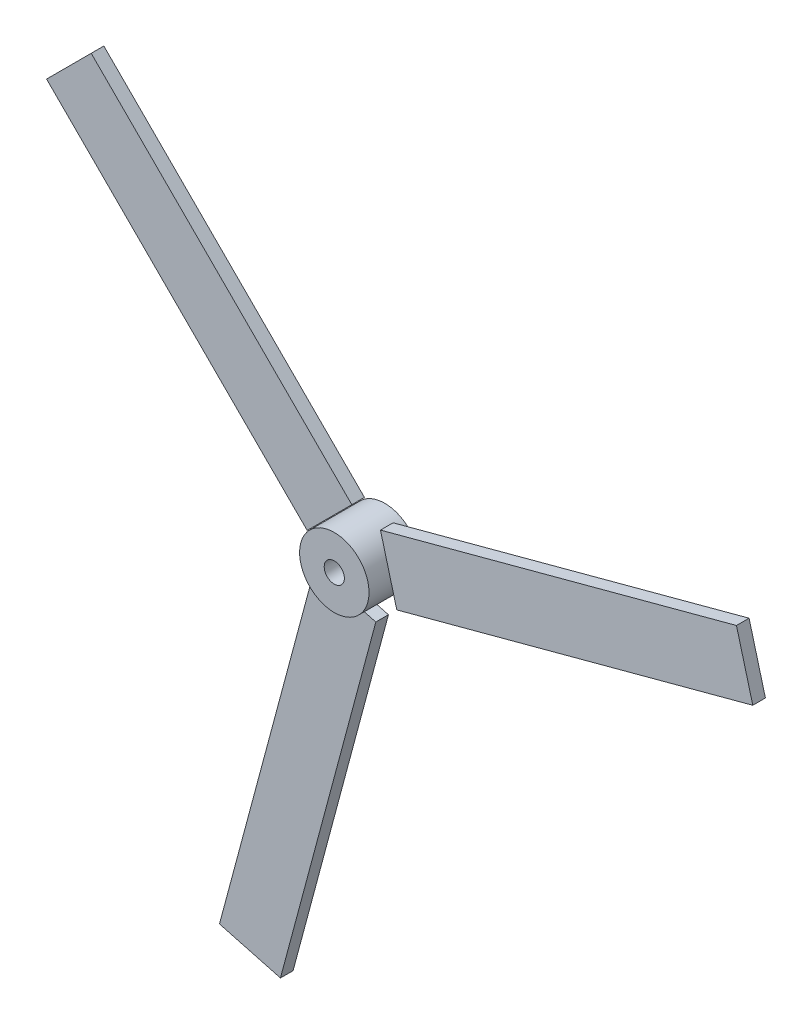
ISO-10303-21;
HEADER;
FILE_DESCRIPTION(('STEP AP214'),'2;1');
FILE_NAME('part.step','',(''),(''),'','','');
FILE_SCHEMA(('AUTOMOTIVE_DESIGN { 1 0 10303 214 1 1 1 1 }'));
ENDSEC;
DATA;
#1=APPLICATION_CONTEXT('core data for automotive mechanical design processes');
#2=APPLICATION_PROTOCOL_DEFINITION('international standard','automotive_design',2000,#1);
#3=PRODUCT_CONTEXT('',#1,'mechanical');
#4=PRODUCT('Part','Part','',(#3));
#5=PRODUCT_RELATED_PRODUCT_CATEGORY('part','',(#4));
#6=PRODUCT_DEFINITION_FORMATION('','',#4);
#7=PRODUCT_DEFINITION_CONTEXT('part definition',#1,'design');
#8=PRODUCT_DEFINITION('design','',#6,#7);
#9=PRODUCT_DEFINITION_SHAPE('','',#8);
#10=(LENGTH_UNIT() NAMED_UNIT(*) SI_UNIT(.MILLI.,.METRE.));
#11=(NAMED_UNIT(*) PLANE_ANGLE_UNIT() SI_UNIT($,.RADIAN.));
#12=(NAMED_UNIT(*) SI_UNIT($,.STERADIAN.) SOLID_ANGLE_UNIT());
#13=UNCERTAINTY_MEASURE_WITH_UNIT(LENGTH_MEASURE(1.E-05),#10,'distance_accuracy_value','');
#14=(GEOMETRIC_REPRESENTATION_CONTEXT(3) GLOBAL_UNCERTAINTY_ASSIGNED_CONTEXT((#13)) GLOBAL_UNIT_ASSIGNED_CONTEXT((#10,
#11,#12)) REPRESENTATION_CONTEXT('',''));
#15=CARTESIAN_POINT('',(0.,0.,0.));
#16=DIRECTION('',(0.,0.,1.));
#17=DIRECTION('',(1.,0.,0.));
#18=AXIS2_PLACEMENT_3D('',#15,#16,#17);
#19=CARTESIAN_POINT('',(-45.57303204747,45.573032047473,13.4));
#20=DIRECTION('',(0.,0.,1.));
#21=DIRECTION('',(1.,0.,0.));
#22=AXIS2_PLACEMENT_3D('',#19,#20,#21);
#23=PLANE('',#22);
#24=CARTESIAN_POINT('',(-45.57303204747,45.573032047473,13.4));
#25=DIRECTION('',(0.,0.,1.));
#26=DIRECTION('',(0.965925826288944,0.258819045102985,0.));
#27=AXIS2_PLACEMENT_3D('',#24,#25,#26);
#28=CIRCLE('',#27,0.8);
#29=CARTESIAN_POINT('',(-44.80029138644,45.780087283555,13.4));
#30=VERTEX_POINT('',#29);
#31=EDGE_CURVE('P0_E25',#30,#30,#28,.T.);
#32=ORIENTED_EDGE('',*,*,#31,.F.);
#33=EDGE_LOOP('',(#32));
#34=FACE_BOUND('',#33,.T.);
#35=CARTESIAN_POINT('',(-45.57303204747,45.573032047473,13.4));
#36=DIRECTION('',(0.,0.,1.));
#37=DIRECTION('',(0.965925826288944,0.258819045102985,0.));
#38=AXIS2_PLACEMENT_3D('',#35,#36,#37);
#39=CIRCLE('',#38,2.75);
#40=CARTESIAN_POINT('',(-42.91673602517,46.284784421505,13.4));
#41=VERTEX_POINT('',#40);
#42=EDGE_CURVE('P0_E59',#41,#41,#39,.T.);
#43=ORIENTED_EDGE('',*,*,#42,.T.);
#44=EDGE_LOOP('',(#43));
#45=FACE_BOUND('',#44,.T.);
#46=ADVANCED_FACE('P0_F17',(#34,#45),#23,.T.);
#47=CARTESIAN_POINT('',(-45.57303204747,45.573032047473,9.4));
#48=DIRECTION('',(0.,0.,1.));
#49=DIRECTION('',(1.,0.,0.));
#50=AXIS2_PLACEMENT_3D('',#47,#48,#49);
#51=PLANE('',#50);
#52=CARTESIAN_POINT('',(-45.57303204747,45.573032047473,9.4));
#53=DIRECTION('',(0.,0.,1.));
#54=DIRECTION('',(0.965925826288944,0.258819045102985,0.));
#55=AXIS2_PLACEMENT_3D('',#52,#53,#54);
#56=CIRCLE('',#55,0.8);
#57=CARTESIAN_POINT('',(-44.80029138644,45.780087283555,9.4));
#58=VERTEX_POINT('',#57);
#59=EDGE_CURVE('P0_E11',#58,#58,#56,.T.);
#60=ORIENTED_EDGE('',*,*,#59,.T.);
#61=EDGE_LOOP('',(#60));
#62=FACE_BOUND('',#61,.T.);
#63=CARTESIAN_POINT('',(-45.57303204747,45.573032047473,9.4));
#64=DIRECTION('',(0.,0.,1.));
#65=DIRECTION('',(0.965925826288944,0.258819045102985,0.));
#66=AXIS2_PLACEMENT_3D('',#63,#64,#65);
#67=CIRCLE('',#66,2.75);
#68=CARTESIAN_POINT('',(-42.91673602517,46.284784421505,9.4));
#69=VERTEX_POINT('',#68);
#70=EDGE_CURVE('P0_E60',#69,#69,#67,.T.);
#71=ORIENTED_EDGE('',*,*,#70,.F.);
#72=EDGE_LOOP('',(#71));
#73=FACE_BOUND('',#72,.T.);
#74=ADVANCED_FACE('P0_F86',(#62,#73),#51,.F.);
#75=CARTESIAN_POINT('',(-45.57303204747,45.573032047473,9.4));
#76=DIRECTION('',(0.,0.,-1.));
#77=DIRECTION('',(0.965925826288944,0.258819045102985,0.));
#78=AXIS2_PLACEMENT_3D('',#75,#76,#77);
#79=CYLINDRICAL_SURFACE('',#78,0.8);
#80=DIRECTION('',(0.,0.,1.));
#81=VECTOR('',#80,1.);
#82=CARTESIAN_POINT('',(-44.80029138644,45.780087283555,9.4));
#83=LINE('',#82,#81);
#84=EDGE_CURVE('P0_E63',#58,#30,#83,.T.);
#85=ORIENTED_EDGE('',*,*,#84,.T.);
#86=ORIENTED_EDGE('',*,*,#31,.T.);
#87=ORIENTED_EDGE('',*,*,#84,.F.);
#88=ORIENTED_EDGE('',*,*,#59,.F.);
#89=EDGE_LOOP('',(#85,#86,#87,#88));
#90=FACE_BOUND('',#89,.T.);
#91=ADVANCED_FACE('P0_F79',(#90),#79,.F.);
#92=CARTESIAN_POINT('',(-45.57303204747,45.573032047473,9.4));
#93=DIRECTION('',(0.,0.,-1.));
#94=DIRECTION('',(0.965925826288944,0.258819045102985,0.));
#95=AXIS2_PLACEMENT_3D('',#92,#93,#94);
#96=CYLINDRICAL_SURFACE('',#95,2.75);
#97=ORIENTED_EDGE('',*,*,#70,.T.);
#98=DIRECTION('',(0.,0.,1.));
#99=VECTOR('',#98,1.);
#100=CARTESIAN_POINT('',(-42.91673602517,46.284784421505,9.4));
#101=LINE('',#100,#99);
#102=EDGE_CURVE('P0_E53',#69,#41,#101,.T.);
#103=ORIENTED_EDGE('',*,*,#102,.T.);
#104=ORIENTED_EDGE('',*,*,#42,.F.);
#105=ORIENTED_EDGE('',*,*,#102,.F.);
#106=EDGE_LOOP('',(#97,#103,#104,#105));
#107=FACE_BOUND('',#106,.T.);
#108=ADVANCED_FACE('P0_F54',(#107),#96,.T.);
#109=CLOSED_SHELL('',(#46,#74,#91,#108));
#110=MANIFOLD_SOLID_BREP('P0_B1',#109);
#111=CARTESIAN_POINT('',(-28.76592267004,50.076483432257,11.8));
#112=DIRECTION('',(0.,0.,1.));
#113=DIRECTION('',(1.,0.,0.));
#114=AXIS2_PLACEMENT_3D('',#111,#112,#113);
#115=PLANE('',#114);
#116=DIRECTION('',(0.965925826288944,0.258819045102985,0.));
#117=VECTOR('',#116,1.);
#118=CARTESIAN_POINT('',(-42.2213921211,43.882910808037,11.8));
#119=LINE('',#118,#117);
#120=CARTESIAN_POINT('',(-42.2213921211,43.882910808037,11.8));
#121=VERTEX_POINT('',#120);
#122=CARTESIAN_POINT('',(-14.01635799346,51.440426925031,11.8));
#123=VERTEX_POINT('',#122);
#124=EDGE_CURVE('P1_E81',#121,#123,#119,.T.);
#125=ORIENTED_EDGE('',*,*,#124,.T.);
#126=DIRECTION('',(-0.258819045102985,0.965925826288944,0.));
#127=VECTOR('',#126,1.);
#128=CARTESIAN_POINT('',(-14.01635799346,51.440426925031,11.8));
#129=LINE('',#128,#127);
#130=CARTESIAN_POINT('',(-15.31045321897,56.270056056476,11.8));
#131=VERTEX_POINT('',#130);
#132=EDGE_CURVE('P1_E104',#123,#131,#129,.T.);
#133=ORIENTED_EDGE('',*,*,#132,.T.);
#134=DIRECTION('',(-0.965925826288944,-0.258819045102985,0.));
#135=VECTOR('',#134,1.);
#136=CARTESIAN_POINT('',(-15.31045321897,56.270056056476,11.8));
#137=LINE('',#136,#135);
#138=CARTESIAN_POINT('',(-43.51548734662,48.712539939483,11.8));
#139=VERTEX_POINT('',#138);
#140=EDGE_CURVE('P1_E72',#131,#139,#137,.T.);
#141=ORIENTED_EDGE('',*,*,#140,.T.);
#142=DIRECTION('',(0.258819045102985,-0.965925826288944,0.));
#143=VECTOR('',#142,1.);
#144=CARTESIAN_POINT('',(-43.51548734662,48.712539939483,11.8));
#145=LINE('',#144,#143);
#146=EDGE_CURVE('P1_E11',#139,#121,#145,.T.);
#147=ORIENTED_EDGE('',*,*,#146,.T.);
#148=EDGE_LOOP('',(#125,#133,#141,#147));
#149=FACE_BOUND('',#148,.T.);
#150=ADVANCED_FACE('P1_F17',(#149),#115,.T.);
#151=CARTESIAN_POINT('',(-28.76592267004,50.076483432257,10.8));
#152=DIRECTION('',(0.,0.,1.));
#153=DIRECTION('',(1.,0.,0.));
#154=AXIS2_PLACEMENT_3D('',#151,#152,#153);
#155=PLANE('',#154);
#156=DIRECTION('',(0.258819045102985,-0.965925826288944,0.));
#157=VECTOR('',#156,1.);
#158=CARTESIAN_POINT('',(-43.51548734662,48.712539939483,10.8));
#159=LINE('',#158,#157);
#160=CARTESIAN_POINT('',(-43.51548734662,48.712539939483,10.8));
#161=VERTEX_POINT('',#160);
#162=CARTESIAN_POINT('',(-42.2213921211,43.882910808037,10.8));
#163=VERTEX_POINT('',#162);
#164=EDGE_CURVE('P1_E25',#161,#163,#159,.T.);
#165=ORIENTED_EDGE('',*,*,#164,.F.);
#166=DIRECTION('',(-0.965925826288944,-0.258819045102985,0.));
#167=VECTOR('',#166,1.);
#168=CARTESIAN_POINT('',(-15.31045321897,56.270056056476,10.8));
#169=LINE('',#168,#167);
#170=CARTESIAN_POINT('',(-15.31045321897,56.270056056476,10.8));
#171=VERTEX_POINT('',#170);
#172=EDGE_CURVE('P1_E108',#171,#161,#169,.T.);
#173=ORIENTED_EDGE('',*,*,#172,.F.);
#174=DIRECTION('',(-0.258819045102985,0.965925826288944,0.));
#175=VECTOR('',#174,1.);
#176=CARTESIAN_POINT('',(-14.01635799346,51.440426925031,10.8));
#177=LINE('',#176,#175);
#178=CARTESIAN_POINT('',(-14.01635799346,51.440426925031,10.8));
#179=VERTEX_POINT('',#178);
#180=EDGE_CURVE('P1_E83',#179,#171,#177,.T.);
#181=ORIENTED_EDGE('',*,*,#180,.F.);
#182=DIRECTION('',(0.965925826288944,0.258819045102985,0.));
#183=VECTOR('',#182,1.);
#184=CARTESIAN_POINT('',(-42.2213921211,43.882910808037,10.8));
#185=LINE('',#184,#183);
#186=EDGE_CURVE('P1_E78',#163,#179,#185,.T.);
#187=ORIENTED_EDGE('',*,*,#186,.F.);
#188=EDGE_LOOP('',(#165,#173,#181,#187));
#189=FACE_BOUND('',#188,.T.);
#190=ADVANCED_FACE('P1_F84',(#189),#155,.F.);
#191=CARTESIAN_POINT('',(-43.51548734662,48.712539939483,10.8));
#192=DIRECTION('',(0.965925826288944,0.258819045102985,0.));
#193=DIRECTION('',(0.,0.,-1.));
#194=AXIS2_PLACEMENT_3D('',#191,#192,#193);
#195=PLANE('',#194);
#196=ORIENTED_EDGE('',*,*,#164,.T.);
#197=DIRECTION('',(0.,0.,1.));
#198=VECTOR('',#197,1.);
#199=CARTESIAN_POINT('',(-42.2213921211,43.882910808037,10.8));
#200=LINE('',#199,#198);
#201=EDGE_CURVE('P1_E68',#163,#121,#200,.T.);
#202=ORIENTED_EDGE('',*,*,#201,.T.);
#203=ORIENTED_EDGE('',*,*,#146,.F.);
#204=DIRECTION('',(0.,0.,1.));
#205=VECTOR('',#204,1.);
#206=CARTESIAN_POINT('',(-43.51548734662,48.712539939483,10.8));
#207=LINE('',#206,#205);
#208=EDGE_CURVE('P1_E75',#161,#139,#207,.T.);
#209=ORIENTED_EDGE('',*,*,#208,.F.);
#210=EDGE_LOOP('',(#196,#202,#203,#209));
#211=FACE_BOUND('',#210,.T.);
#212=ADVANCED_FACE('P1_F70',(#211),#195,.F.);
#213=CARTESIAN_POINT('',(-15.31045321897,56.270056056476,10.8));
#214=DIRECTION('',(0.258819045102985,-0.965925826288944,0.));
#215=DIRECTION('',(0.,0.,-1.));
#216=AXIS2_PLACEMENT_3D('',#213,#214,#215);
#217=PLANE('',#216);
#218=ORIENTED_EDGE('',*,*,#172,.T.);
#219=ORIENTED_EDGE('',*,*,#208,.T.);
#220=ORIENTED_EDGE('',*,*,#140,.F.);
#221=DIRECTION('',(0.,0.,1.));
#222=VECTOR('',#221,1.);
#223=CARTESIAN_POINT('',(-15.31045321897,56.270056056476,10.8));
#224=LINE('',#223,#222);
#225=EDGE_CURVE('P1_E97',#171,#131,#224,.T.);
#226=ORIENTED_EDGE('',*,*,#225,.F.);
#227=EDGE_LOOP('',(#218,#219,#220,#226));
#228=FACE_BOUND('',#227,.T.);
#229=ADVANCED_FACE('P1_F113',(#228),#217,.F.);
#230=CARTESIAN_POINT('',(-14.01635799346,51.440426925031,10.8));
#231=DIRECTION('',(-0.965925826288944,-0.258819045102985,0.));
#232=DIRECTION('',(-0.258819045102985,0.965925826288944,0.));
#233=AXIS2_PLACEMENT_3D('',#230,#231,#232);
#234=PLANE('',#233);
#235=ORIENTED_EDGE('',*,*,#180,.T.);
#236=ORIENTED_EDGE('',*,*,#225,.T.);
#237=ORIENTED_EDGE('',*,*,#132,.F.);
#238=DIRECTION('',(0.,0.,1.));
#239=VECTOR('',#238,1.);
#240=CARTESIAN_POINT('',(-14.01635799346,51.440426925031,10.8));
#241=LINE('',#240,#239);
#242=EDGE_CURVE('P1_E90',#179,#123,#241,.T.);
#243=ORIENTED_EDGE('',*,*,#242,.F.);
#244=EDGE_LOOP('',(#235,#236,#237,#243));
#245=FACE_BOUND('',#244,.T.);
#246=ADVANCED_FACE('P1_F119',(#245),#234,.F.);
#247=CARTESIAN_POINT('',(-42.2213921211,43.882910808037,10.8));
#248=DIRECTION('',(-0.258819045102985,0.965925826288944,0.));
#249=DIRECTION('',(0.,0.,1.));
#250=AXIS2_PLACEMENT_3D('',#247,#248,#249);
#251=PLANE('',#250);
#252=ORIENTED_EDGE('',*,*,#186,.T.);
#253=ORIENTED_EDGE('',*,*,#242,.T.);
#254=ORIENTED_EDGE('',*,*,#124,.F.);
#255=ORIENTED_EDGE('',*,*,#201,.F.);
#256=EDGE_LOOP('',(#252,#253,#254,#255));
#257=FACE_BOUND('',#256,.T.);
#258=ADVANCED_FACE('P1_F80',(#257),#251,.F.);
#259=CLOSED_SHELL('',(#150,#190,#212,#229,#246,#258));
#260=MANIFOLD_SOLID_BREP('P1_B1',#259);
#261=CARTESIAN_POINT('',(-57.87669004011,57.876690040119,11.8));
#262=DIRECTION('',(0.,0.,1.));
#263=DIRECTION('',(1.,0.,0.));
#264=AXIS2_PLACEMENT_3D('',#261,#262,#263);
#265=PLANE('',#264);
#266=DIRECTION('',(-0.707106781186548,0.707106781186548,0.));
#267=VECTOR('',#266,1.);
#268=CARTESIAN_POINT('',(-45.78516408182,49.320697987762,11.8));
#269=LINE('',#268,#267);
#270=CARTESIAN_POINT('',(-45.78516408182,49.320697987762,11.8));
#271=VERTEX_POINT('',#270);
#272=CARTESIAN_POINT('',(-66.43268209247,69.968215998409,11.8));
#273=VERTEX_POINT('',#272);
#274=EDGE_CURVE('P2_E85',#271,#273,#269,.T.);
#275=ORIENTED_EDGE('',*,*,#274,.T.);
#276=DIRECTION('',(-0.707106781186548,-0.707106781186548,0.));
#277=VECTOR('',#276,1.);
#278=CARTESIAN_POINT('',(-66.43268209247,69.968215998409,11.8));
#279=LINE('',#278,#277);
#280=CARTESIAN_POINT('',(-69.9682159984,66.432682092476,11.8));
#281=VERTEX_POINT('',#280);
#282=EDGE_CURVE('P2_E110',#273,#281,#279,.T.);
#283=ORIENTED_EDGE('',*,*,#282,.T.);
#284=DIRECTION('',(0.707106781186548,-0.707106781186548,0.));
#285=VECTOR('',#284,1.);
#286=CARTESIAN_POINT('',(-69.9682159984,66.432682092476,11.8));
#287=LINE('',#286,#285);
#288=CARTESIAN_POINT('',(-49.32069798776,45.785164081829,11.8));
#289=VERTEX_POINT('',#288);
#290=EDGE_CURVE('P2_E74',#281,#289,#287,.T.);
#291=ORIENTED_EDGE('',*,*,#290,.T.);
#292=DIRECTION('',(0.707106781186548,0.707106781186548,0.));
#293=VECTOR('',#292,1.);
#294=CARTESIAN_POINT('',(-49.32069798776,45.785164081829,11.8));
#295=LINE('',#294,#293);
#296=EDGE_CURVE('P2_E11',#289,#271,#295,.T.);
#297=ORIENTED_EDGE('',*,*,#296,.T.);
#298=EDGE_LOOP('',(#275,#283,#291,#297));
#299=FACE_BOUND('',#298,.T.);
#300=ADVANCED_FACE('P2_F17',(#299),#265,.T.);
#301=CARTESIAN_POINT('',(-57.87669004011,57.876690040119,10.8));
#302=DIRECTION('',(0.,0.,1.));
#303=DIRECTION('',(1.,0.,0.));
#304=AXIS2_PLACEMENT_3D('',#301,#302,#303);
#305=PLANE('',#304);
#306=DIRECTION('',(0.707106781186548,0.707106781186548,0.));
#307=VECTOR('',#306,1.);
#308=CARTESIAN_POINT('',(-49.32069798776,45.785164081829,10.8));
#309=LINE('',#308,#307);
#310=CARTESIAN_POINT('',(-49.32069798776,45.785164081829,10.8));
#311=VERTEX_POINT('',#310);
#312=CARTESIAN_POINT('',(-45.78516408182,49.320697987762,10.8));
#313=VERTEX_POINT('',#312);
#314=EDGE_CURVE('P2_E20',#311,#313,#309,.T.);
#315=ORIENTED_EDGE('',*,*,#314,.F.);
#316=DIRECTION('',(0.707106781186548,-0.707106781186548,0.));
#317=VECTOR('',#316,1.);
#318=CARTESIAN_POINT('',(-69.9682159984,66.432682092476,10.8));
#319=LINE('',#318,#317);
#320=CARTESIAN_POINT('',(-69.9682159984,66.432682092476,10.8));
#321=VERTEX_POINT('',#320);
#322=EDGE_CURVE('P2_E100',#321,#311,#319,.T.);
#323=ORIENTED_EDGE('',*,*,#322,.F.);
#324=DIRECTION('',(-0.707106781186548,-0.707106781186548,0.));
#325=VECTOR('',#324,1.);
#326=CARTESIAN_POINT('',(-66.43268209247,69.968215998409,10.8));
#327=LINE('',#326,#325);
#328=CARTESIAN_POINT('',(-66.43268209247,69.968215998409,10.8));
#329=VERTEX_POINT('',#328);
#330=EDGE_CURVE('P2_E82',#329,#321,#327,.T.);
#331=ORIENTED_EDGE('',*,*,#330,.F.);
#332=DIRECTION('',(-0.707106781186548,0.707106781186548,0.));
#333=VECTOR('',#332,1.);
#334=CARTESIAN_POINT('',(-45.78516408182,49.320697987762,10.8));
#335=LINE('',#334,#333);
#336=EDGE_CURVE('P2_E79',#313,#329,#335,.T.);
#337=ORIENTED_EDGE('',*,*,#336,.F.);
#338=EDGE_LOOP('',(#315,#323,#331,#337));
#339=FACE_BOUND('',#338,.T.);
#340=ADVANCED_FACE('P2_F88',(#339),#305,.F.);
#341=CARTESIAN_POINT('',(-49.32069798776,45.785164081829,10.8));
#342=DIRECTION('',(-0.707106781186548,0.707106781186548,0.));
#343=DIRECTION('',(0.,0.,1.));
#344=AXIS2_PLACEMENT_3D('',#341,#342,#343);
#345=PLANE('',#344);
#346=ORIENTED_EDGE('',*,*,#314,.T.);
#347=DIRECTION('',(0.,0.,1.));
#348=VECTOR('',#347,1.);
#349=CARTESIAN_POINT('',(-45.78516408182,49.320697987762,10.8));
#350=LINE('',#349,#348);
#351=EDGE_CURVE('P2_E67',#313,#271,#350,.T.);
#352=ORIENTED_EDGE('',*,*,#351,.T.);
#353=ORIENTED_EDGE('',*,*,#296,.F.);
#354=DIRECTION('',(0.,0.,1.));
#355=VECTOR('',#354,1.);
#356=CARTESIAN_POINT('',(-49.32069798776,45.785164081829,10.8));
#357=LINE('',#356,#355);
#358=EDGE_CURVE('P2_E71',#311,#289,#357,.T.);
#359=ORIENTED_EDGE('',*,*,#358,.F.);
#360=EDGE_LOOP('',(#346,#352,#353,#359));
#361=FACE_BOUND('',#360,.T.);
#362=ADVANCED_FACE('P2_F68',(#361),#345,.F.);
#363=CARTESIAN_POINT('',(-69.9682159984,66.432682092476,10.8));
#364=DIRECTION('',(0.707106781186548,0.707106781186548,0.));
#365=DIRECTION('',(0.,0.,-1.));
#366=AXIS2_PLACEMENT_3D('',#363,#364,#365);
#367=PLANE('',#366);
#368=ORIENTED_EDGE('',*,*,#322,.T.);
#369=ORIENTED_EDGE('',*,*,#358,.T.);
#370=ORIENTED_EDGE('',*,*,#290,.F.);
#371=DIRECTION('',(0.,0.,1.));
#372=VECTOR('',#371,1.);
#373=CARTESIAN_POINT('',(-69.9682159984,66.432682092476,10.8));
#374=LINE('',#373,#372);
#375=EDGE_CURVE('P2_E103',#321,#281,#374,.T.);
#376=ORIENTED_EDGE('',*,*,#375,.F.);
#377=EDGE_LOOP('',(#368,#369,#370,#376));
#378=FACE_BOUND('',#377,.T.);
#379=ADVANCED_FACE('P2_F117',(#378),#367,.F.);
#380=CARTESIAN_POINT('',(-66.43268209247,69.968215998409,10.8));
#381=DIRECTION('',(0.707106781186548,-0.707106781186548,0.));
#382=DIRECTION('',(0.,0.,-1.));
#383=AXIS2_PLACEMENT_3D('',#380,#381,#382);
#384=PLANE('',#383);
#385=ORIENTED_EDGE('',*,*,#330,.T.);
#386=ORIENTED_EDGE('',*,*,#375,.T.);
#387=ORIENTED_EDGE('',*,*,#282,.F.);
#388=DIRECTION('',(0.,0.,1.));
#389=VECTOR('',#388,1.);
#390=CARTESIAN_POINT('',(-66.43268209247,69.968215998409,10.8));
#391=LINE('',#390,#389);
#392=EDGE_CURVE('P2_E89',#329,#273,#391,.T.);
#393=ORIENTED_EDGE('',*,*,#392,.F.);
#394=EDGE_LOOP('',(#385,#386,#387,#393));
#395=FACE_BOUND('',#394,.T.);
#396=ADVANCED_FACE('P2_F125',(#395),#384,.F.);
#397=CARTESIAN_POINT('',(-45.78516408182,49.320697987762,10.8));
#398=DIRECTION('',(-0.707106781186548,-0.707106781186548,0.));
#399=DIRECTION('',(-0.707106781186548,0.707106781186548,0.));
#400=AXIS2_PLACEMENT_3D('',#397,#398,#399);
#401=PLANE('',#400);
#402=ORIENTED_EDGE('',*,*,#336,.T.);
#403=ORIENTED_EDGE('',*,*,#392,.T.);
#404=ORIENTED_EDGE('',*,*,#274,.F.);
#405=ORIENTED_EDGE('',*,*,#351,.F.);
#406=EDGE_LOOP('',(#402,#403,#404,#405));
#407=FACE_BOUND('',#406,.T.);
#408=ADVANCED_FACE('P2_F77',(#407),#401,.F.);
#409=CLOSED_SHELL('',(#300,#340,#362,#379,#396,#408));
#410=MANIFOLD_SOLID_BREP('P2_B1',#409);
#411=CARTESIAN_POINT('',(-50.07648343225,28.765922670043,11.8));
#412=DIRECTION('',(0.,0.,1.));
#413=DIRECTION('',(1.,0.,0.));
#414=AXIS2_PLACEMENT_3D('',#411,#412,#413);
#415=PLANE('',#414);
#416=DIRECTION('',(-0.258819045102985,-0.965925826288944,0.));
#417=VECTOR('',#416,1.);
#418=CARTESIAN_POINT('',(-48.71253993948,43.51548734662,11.8));
#419=LINE('',#418,#417);
#420=CARTESIAN_POINT('',(-48.71253993948,43.51548734662,11.8));
#421=VERTEX_POINT('',#420);
#422=CARTESIAN_POINT('',(-56.27005605647,15.310453218979,11.8));
#423=VERTEX_POINT('',#422);
#424=EDGE_CURVE('P3_E81',#421,#423,#419,.T.);
#425=ORIENTED_EDGE('',*,*,#424,.T.);
#426=DIRECTION('',(0.965925826288944,-0.258819045102985,0.));
#427=VECTOR('',#426,1.);
#428=CARTESIAN_POINT('',(-56.27005605647,15.310453218979,11.8));
#429=LINE('',#428,#427);
#430=CARTESIAN_POINT('',(-51.44042692503,14.016357993467,11.8));
#431=VERTEX_POINT('',#430);
#432=EDGE_CURVE('P3_E103',#423,#431,#429,.T.);
#433=ORIENTED_EDGE('',*,*,#432,.T.);
#434=DIRECTION('',(0.258819045102985,0.965925826288944,0.));
#435=VECTOR('',#434,1.);
#436=CARTESIAN_POINT('',(-51.44042692503,14.016357993467,11.8));
#437=LINE('',#436,#435);
#438=CARTESIAN_POINT('',(-43.88291080803,42.221392121107,11.8));
#439=VERTEX_POINT('',#438);
#440=EDGE_CURVE('P3_E72',#431,#439,#437,.T.);
#441=ORIENTED_EDGE('',*,*,#440,.T.);
#442=DIRECTION('',(-0.965925826288944,0.258819045102985,0.));
#443=VECTOR('',#442,1.);
#444=CARTESIAN_POINT('',(-43.88291080803,42.221392121107,11.8));
#445=LINE('',#444,#443);
#446=EDGE_CURVE('P3_E10',#439,#421,#445,.T.);
#447=ORIENTED_EDGE('',*,*,#446,.T.);
#448=EDGE_LOOP('',(#425,#433,#441,#447));
#449=FACE_BOUND('',#448,.T.);
#450=ADVANCED_FACE('P3_F16',(#449),#415,.T.);
#451=CARTESIAN_POINT('',(-50.07648343225,28.765922670043,10.8));
#452=DIRECTION('',(0.,0.,1.));
#453=DIRECTION('',(1.,0.,0.));
#454=AXIS2_PLACEMENT_3D('',#451,#452,#453);
#455=PLANE('',#454);
#456=DIRECTION('',(-0.965925826288944,0.258819045102985,0.));
#457=VECTOR('',#456,1.);
#458=CARTESIAN_POINT('',(-43.88291080803,42.221392121107,10.8));
#459=LINE('',#458,#457);
#460=CARTESIAN_POINT('',(-43.88291080803,42.221392121107,10.8));
#461=VERTEX_POINT('',#460);
#462=CARTESIAN_POINT('',(-48.71253993948,43.51548734662,10.8));
#463=VERTEX_POINT('',#462);
#464=EDGE_CURVE('P3_E19',#461,#463,#459,.T.);
#465=ORIENTED_EDGE('',*,*,#464,.F.);
#466=DIRECTION('',(0.258819045102985,0.965925826288944,0.));
#467=VECTOR('',#466,1.);
#468=CARTESIAN_POINT('',(-51.44042692503,14.016357993467,10.8));
#469=LINE('',#468,#467);
#470=CARTESIAN_POINT('',(-51.44042692503,14.016357993467,10.8));
#471=VERTEX_POINT('',#470);
#472=EDGE_CURVE('P3_E106',#471,#461,#469,.T.);
#473=ORIENTED_EDGE('',*,*,#472,.F.);
#474=DIRECTION('',(0.965925826288944,-0.258819045102985,0.));
#475=VECTOR('',#474,1.);
#476=CARTESIAN_POINT('',(-56.27005605647,15.310453218979,10.8));
#477=LINE('',#476,#475);
#478=CARTESIAN_POINT('',(-56.27005605647,15.310453218979,10.8));
#479=VERTEX_POINT('',#478);
#480=EDGE_CURVE('P3_E83',#479,#471,#477,.T.);
#481=ORIENTED_EDGE('',*,*,#480,.F.);
#482=DIRECTION('',(-0.258819045102985,-0.965925826288944,0.));
#483=VECTOR('',#482,1.);
#484=CARTESIAN_POINT('',(-48.71253993948,43.51548734662,10.8));
#485=LINE('',#484,#483);
#486=EDGE_CURVE('P3_E78',#463,#479,#485,.T.);
#487=ORIENTED_EDGE('',*,*,#486,.F.);
#488=EDGE_LOOP('',(#465,#473,#481,#487));
#489=FACE_BOUND('',#488,.T.);
#490=ADVANCED_FACE('P3_F84',(#489),#455,.F.);
#491=CARTESIAN_POINT('',(-43.88291080803,42.221392121107,10.8));
#492=DIRECTION('',(-0.258819045102985,-0.965925826288944,0.));
#493=DIRECTION('',(-0.965925826288944,0.258819045102985,0.));
#494=AXIS2_PLACEMENT_3D('',#491,#492,#493);
#495=PLANE('',#494);
#496=ORIENTED_EDGE('',*,*,#464,.T.);
#497=DIRECTION('',(0.,0.,1.));
#498=VECTOR('',#497,1.);
#499=CARTESIAN_POINT('',(-48.71253993948,43.51548734662,10.8));
#500=LINE('',#499,#498);
#501=EDGE_CURVE('P3_E68',#463,#421,#500,.T.);
#502=ORIENTED_EDGE('',*,*,#501,.T.);
#503=ORIENTED_EDGE('',*,*,#446,.F.);
#504=DIRECTION('',(0.,0.,1.));
#505=VECTOR('',#504,1.);
#506=CARTESIAN_POINT('',(-43.88291080803,42.221392121107,10.8));
#507=LINE('',#506,#505);
#508=EDGE_CURVE('P3_E75',#461,#439,#507,.T.);
#509=ORIENTED_EDGE('',*,*,#508,.F.);
#510=EDGE_LOOP('',(#496,#502,#503,#509));
#511=FACE_BOUND('',#510,.T.);
#512=ADVANCED_FACE('P3_F70',(#511),#495,.F.);
#513=CARTESIAN_POINT('',(-51.44042692503,14.016357993467,10.8));
#514=DIRECTION('',(-0.965925826288944,0.258819045102985,0.));
#515=DIRECTION('',(0.,0.,1.));
#516=AXIS2_PLACEMENT_3D('',#513,#514,#515);
#517=PLANE('',#516);
#518=ORIENTED_EDGE('',*,*,#472,.T.);
#519=ORIENTED_EDGE('',*,*,#508,.T.);
#520=ORIENTED_EDGE('',*,*,#440,.F.);
#521=DIRECTION('',(0.,0.,1.));
#522=VECTOR('',#521,1.);
#523=CARTESIAN_POINT('',(-51.44042692503,14.016357993467,10.8));
#524=LINE('',#523,#522);
#525=EDGE_CURVE('P3_E96',#471,#431,#524,.T.);
#526=ORIENTED_EDGE('',*,*,#525,.F.);
#527=EDGE_LOOP('',(#518,#519,#520,#526));
#528=FACE_BOUND('',#527,.T.);
#529=ADVANCED_FACE('P3_F116',(#528),#517,.F.);
#530=CARTESIAN_POINT('',(-56.27005605647,15.310453218979,10.8));
#531=DIRECTION('',(0.258819045102985,0.965925826288944,0.));
#532=DIRECTION('',(0.,0.,-1.));
#533=AXIS2_PLACEMENT_3D('',#530,#531,#532);
#534=PLANE('',#533);
#535=ORIENTED_EDGE('',*,*,#480,.T.);
#536=ORIENTED_EDGE('',*,*,#525,.T.);
#537=ORIENTED_EDGE('',*,*,#432,.F.);
#538=DIRECTION('',(0.,0.,1.));
#539=VECTOR('',#538,1.);
#540=CARTESIAN_POINT('',(-56.27005605647,15.310453218979,10.8));
#541=LINE('',#540,#539);
#542=EDGE_CURVE('P3_E90',#479,#423,#541,.T.);
#543=ORIENTED_EDGE('',*,*,#542,.F.);
#544=EDGE_LOOP('',(#535,#536,#537,#543));
#545=FACE_BOUND('',#544,.T.);
#546=ADVANCED_FACE('P3_F119',(#545),#534,.F.);
#547=CARTESIAN_POINT('',(-48.71253993948,43.51548734662,10.8));
#548=DIRECTION('',(0.965925826288944,-0.258819045102985,0.));
#549=DIRECTION('',(0.,0.,-1.));
#550=AXIS2_PLACEMENT_3D('',#547,#548,#549);
#551=PLANE('',#550);
#552=ORIENTED_EDGE('',*,*,#486,.T.);
#553=ORIENTED_EDGE('',*,*,#542,.T.);
#554=ORIENTED_EDGE('',*,*,#424,.F.);
#555=ORIENTED_EDGE('',*,*,#501,.F.);
#556=EDGE_LOOP('',(#552,#553,#554,#555));
#557=FACE_BOUND('',#556,.T.);
#558=ADVANCED_FACE('P3_F80',(#557),#551,.F.);
#559=CLOSED_SHELL('',(#450,#490,#512,#529,#546,#558));
#560=MANIFOLD_SOLID_BREP('P3_B1',#559);
#561=ADVANCED_BREP_SHAPE_REPRESENTATION('',(#18,#110,#260,#410,#560),#14);
#562=SHAPE_DEFINITION_REPRESENTATION(#9,#561);
ENDSEC;
END-ISO-10303-21;
